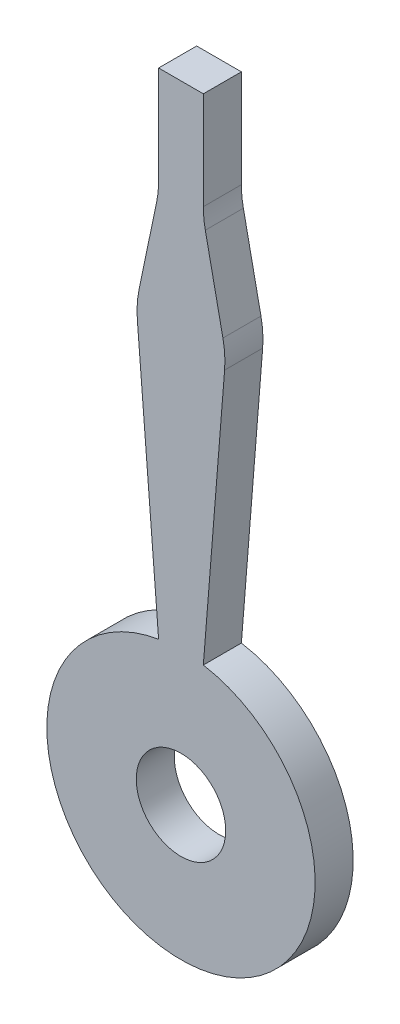
ISO-10303-21;
HEADER;
FILE_DESCRIPTION(('STEP AP214'),'2;1');
FILE_NAME('part.step','',(''),(''),'','','');
FILE_SCHEMA(('AUTOMOTIVE_DESIGN { 1 0 10303 214 1 1 1 1 }'));
ENDSEC;
DATA;
#1=APPLICATION_CONTEXT('core data for automotive mechanical design processes');
#2=APPLICATION_PROTOCOL_DEFINITION('international standard','automotive_design',2000,#1);
#3=PRODUCT_CONTEXT('',#1,'mechanical');
#4=PRODUCT('Part','Part','',(#3));
#5=PRODUCT_RELATED_PRODUCT_CATEGORY('part','',(#4));
#6=PRODUCT_DEFINITION_FORMATION('','',#4);
#7=PRODUCT_DEFINITION_CONTEXT('part definition',#1,'design');
#8=PRODUCT_DEFINITION('design','',#6,#7);
#9=PRODUCT_DEFINITION_SHAPE('','',#8);
#10=(LENGTH_UNIT() NAMED_UNIT(*) SI_UNIT(.MILLI.,.METRE.));
#11=(NAMED_UNIT(*) PLANE_ANGLE_UNIT() SI_UNIT($,.RADIAN.));
#12=(NAMED_UNIT(*) SI_UNIT($,.STERADIAN.) SOLID_ANGLE_UNIT());
#13=UNCERTAINTY_MEASURE_WITH_UNIT(LENGTH_MEASURE(1.E-05),#10,'distance_accuracy_value','');
#14=(GEOMETRIC_REPRESENTATION_CONTEXT(3) GLOBAL_UNCERTAINTY_ASSIGNED_CONTEXT((#13)) GLOBAL_UNIT_ASSIGNED_CONTEXT((#10,
#11,#12)) REPRESENTATION_CONTEXT('',''));
#15=CARTESIAN_POINT('',(0.,0.,0.));
#16=DIRECTION('',(0.,0.,1.));
#17=DIRECTION('',(1.,0.,0.));
#18=AXIS2_PLACEMENT_3D('',#15,#16,#17);
#19=CARTESIAN_POINT('',(0.,65.9,4.));
#20=DIRECTION('',(0.,1.,0.));
#21=DIRECTION('',(0.,0.,1.));
#22=AXIS2_PLACEMENT_3D('',#19,#20,#21);
#23=PLANE('',#22);
#24=DIRECTION('',(1.,0.,0.));
#25=VECTOR('',#24,1.);
#26=CARTESIAN_POINT('',(0.,65.9,0.));
#27=LINE('',#26,#25);
#28=CARTESIAN_POINT('',(-2.35,65.9,0.));
#29=VERTEX_POINT('',#28);
#30=CARTESIAN_POINT('',(2.35,65.9,0.));
#31=VERTEX_POINT('',#30);
#32=EDGE_CURVE('E155',#29,#31,#27,.T.);
#33=ORIENTED_EDGE('',*,*,#32,.F.);
#34=DIRECTION('',(0.,0.,-1.));
#35=VECTOR('',#34,1.);
#36=CARTESIAN_POINT('',(-2.35,65.9,4.));
#37=LINE('',#36,#35);
#38=CARTESIAN_POINT('',(-2.35,65.9,4.));
#39=VERTEX_POINT('',#38);
#40=EDGE_CURVE('E11',#39,#29,#37,.T.);
#41=ORIENTED_EDGE('',*,*,#40,.F.);
#42=DIRECTION('',(1.,0.,0.));
#43=VECTOR('',#42,1.);
#44=CARTESIAN_POINT('',(0.,65.9,4.));
#45=LINE('',#44,#43);
#46=CARTESIAN_POINT('',(2.35,65.9,4.));
#47=VERTEX_POINT('',#46);
#48=EDGE_CURVE('E189',#39,#47,#45,.T.);
#49=ORIENTED_EDGE('',*,*,#48,.T.);
#50=DIRECTION('',(0.,0.,-1.));
#51=VECTOR('',#50,1.);
#52=CARTESIAN_POINT('',(2.35,65.9,4.));
#53=LINE('',#52,#51);
#54=EDGE_CURVE('E51',#47,#31,#53,.T.);
#55=ORIENTED_EDGE('',*,*,#54,.T.);
#56=EDGE_LOOP('',(#33,#41,#49,#55));
#57=FACE_BOUND('',#56,.T.);
#58=ADVANCED_FACE('F35',(#57),#23,.T.);
#59=CARTESIAN_POINT('',(-2.3500000000005,0.,4.));
#60=DIRECTION('',(-1.,0.,0.));
#61=DIRECTION('',(0.,-1.,0.));
#62=AXIS2_PLACEMENT_3D('',#59,#60,#61);
#63=PLANE('',#62);
#64=DIRECTION('',(0.,1.,0.));
#65=VECTOR('',#64,1.);
#66=CARTESIAN_POINT('',(-2.3500000000005,0.,0.));
#67=LINE('',#66,#65);
#68=CARTESIAN_POINT('',(-2.35000000000008,55.6253357668643,0.));
#69=VERTEX_POINT('',#68);
#70=EDGE_CURVE('E157',#69,#29,#67,.T.);
#71=ORIENTED_EDGE('',*,*,#70,.F.);
#72=DIRECTION('',(0.,0.,-1.));
#73=VECTOR('',#72,1.);
#74=CARTESIAN_POINT('',(-2.35000000000008,55.6253357668643,4.));
#75=LINE('',#74,#73);
#76=CARTESIAN_POINT('',(-2.35000000000008,55.6253357668643,4.));
#77=VERTEX_POINT('',#76);
#78=EDGE_CURVE('E43',#77,#69,#75,.T.);
#79=ORIENTED_EDGE('',*,*,#78,.F.);
#80=DIRECTION('',(0.,1.,0.));
#81=VECTOR('',#80,1.);
#82=CARTESIAN_POINT('',(-2.3500000000005,0.,4.));
#83=LINE('',#82,#81);
#84=EDGE_CURVE('E221',#77,#39,#83,.T.);
#85=ORIENTED_EDGE('',*,*,#84,.T.);
#86=ORIENTED_EDGE('',*,*,#40,.T.);
#87=EDGE_LOOP('',(#71,#79,#85,#86));
#88=FACE_BOUND('',#87,.T.);
#89=ADVANCED_FACE('F220',(#88),#63,.T.);
#90=CARTESIAN_POINT('',(-12.35,55.6253357668643,4.));
#91=DIRECTION('',(0.,0.,-1.));
#92=DIRECTION('',(-1.,0.,0.));
#93=AXIS2_PLACEMENT_3D('',#90,#91,#92);
#94=CYLINDRICAL_SURFACE('',#93,9.99999999999992);
#95=CARTESIAN_POINT('',(-12.35,55.6253357668643,0.));
#96=DIRECTION('',(0.,0.,1.));
#97=DIRECTION('',(1.,0.,0.));
#98=AXIS2_PLACEMENT_3D('',#95,#96,#97);
#99=CIRCLE('',#98,9.99999999999992);
#100=CARTESIAN_POINT('',(-2.55936084221021,53.5898051525154,0.));
#101=VERTEX_POINT('',#100);
#102=EDGE_CURVE('E160',#69,#101,#99,.F.);
#103=ORIENTED_EDGE('',*,*,#102,.T.);
#104=DIRECTION('',(0.,0.,-1.));
#105=VECTOR('',#104,1.);
#106=CARTESIAN_POINT('',(-2.55936084221021,53.5898051525154,4.));
#107=LINE('',#106,#105);
#108=CARTESIAN_POINT('',(-2.55936084221021,53.5898051525154,4.));
#109=VERTEX_POINT('',#108);
#110=EDGE_CURVE('E204',#109,#101,#107,.T.);
#111=ORIENTED_EDGE('',*,*,#110,.F.);
#112=CARTESIAN_POINT('',(-12.35,55.6253357668643,4.));
#113=DIRECTION('',(0.,0.,1.));
#114=DIRECTION('',(1.,0.,0.));
#115=AXIS2_PLACEMENT_3D('',#112,#113,#114);
#116=CIRCLE('',#115,9.99999999999992);
#117=EDGE_CURVE('E210',#77,#109,#116,.F.);
#118=ORIENTED_EDGE('',*,*,#117,.F.);
#119=ORIENTED_EDGE('',*,*,#78,.T.);
#120=EDGE_LOOP('',(#103,#111,#118,#119));
#121=FACE_BOUND('',#120,.T.);
#122=ADVANCED_FACE('F208',(#121),#94,.F.);
#123=CARTESIAN_POINT('',(-13.1333070424788,2.73049063720624,4.));
#124=DIRECTION('',(-0.979063915778987,0.203553061434893,0.));
#125=DIRECTION('',(-0.203553061434893,-0.979063915778987,0.));
#126=AXIS2_PLACEMENT_3D('',#123,#124,#125);
#127=PLANE('',#126);
#128=DIRECTION('',(0.203553061434893,0.979063915778987,0.));
#129=VECTOR('',#128,1.);
#130=CARTESIAN_POINT('',(-13.1333070424788,2.73049063720624,0.));
#131=LINE('',#130,#129);
#132=CARTESIAN_POINT('',(-4.40819343713173,44.6971593370033,0.));
#133=VERTEX_POINT('',#132);
#134=EDGE_CURVE('E163',#133,#101,#131,.T.);
#135=ORIENTED_EDGE('',*,*,#134,.F.);
#136=DIRECTION('',(0.,0.,-1.));
#137=VECTOR('',#136,1.);
#138=CARTESIAN_POINT('',(-4.40819343713173,44.6971593370033,4.));
#139=LINE('',#138,#137);
#140=CARTESIAN_POINT('',(-4.40819343713173,44.6971593370033,4.));
#141=VERTEX_POINT('',#140);
#142=EDGE_CURVE('E202',#141,#133,#139,.T.);
#143=ORIENTED_EDGE('',*,*,#142,.F.);
#144=DIRECTION('',(0.203553061434893,0.979063915778987,0.));
#145=VECTOR('',#144,1.);
#146=CARTESIAN_POINT('',(-13.1333070424788,2.73049063720624,4.));
#147=LINE('',#146,#145);
#148=EDGE_CURVE('E390',#141,#109,#147,.T.);
#149=ORIENTED_EDGE('',*,*,#148,.T.);
#150=ORIENTED_EDGE('',*,*,#110,.T.);
#151=EDGE_LOOP('',(#135,#143,#149,#150));
#152=FACE_BOUND('',#151,.T.);
#153=ADVANCED_FACE('F240',(#152),#127,.T.);
#154=CARTESIAN_POINT('',(5.38244572065814,42.6616287226543,4.));
#155=DIRECTION('',(0.,0.,-1.));
#156=DIRECTION('',(-1.,0.,0.));
#157=AXIS2_PLACEMENT_3D('',#154,#155,#156);
#158=CYLINDRICAL_SURFACE('',#157,10.);
#159=CARTESIAN_POINT('',(5.38244572065814,42.6616287226543,0.));
#160=DIRECTION('',(0.,0.,1.));
#161=DIRECTION('',(1.,0.,0.));
#162=AXIS2_PLACEMENT_3D('',#159,#160,#161);
#163=CIRCLE('',#162,10.);
#164=CARTESIAN_POINT('',(-4.58574117645546,41.8646030115178,0.));
#165=VERTEX_POINT('',#164);
#166=EDGE_CURVE('E166',#133,#165,#163,.T.);
#167=ORIENTED_EDGE('',*,*,#166,.T.);
#168=DIRECTION('',(0.,0.,-1.));
#169=VECTOR('',#168,1.);
#170=CARTESIAN_POINT('',(-4.58574117645546,41.8646030115178,4.));
#171=LINE('',#170,#169);
#172=CARTESIAN_POINT('',(-4.58574117645546,41.8646030115178,4.));
#173=VERTEX_POINT('',#172);
#174=EDGE_CURVE('E200',#173,#165,#171,.T.);
#175=ORIENTED_EDGE('',*,*,#174,.F.);
#176=CARTESIAN_POINT('',(5.38244572065814,42.6616287226543,4.));
#177=DIRECTION('',(0.,0.,1.));
#178=DIRECTION('',(1.,0.,0.));
#179=AXIS2_PLACEMENT_3D('',#176,#177,#178);
#180=CIRCLE('',#179,10.);
#181=EDGE_CURVE('E391',#141,#173,#180,.T.);
#182=ORIENTED_EDGE('',*,*,#181,.F.);
#183=ORIENTED_EDGE('',*,*,#142,.T.);
#184=EDGE_LOOP('',(#167,#175,#182,#183));
#185=FACE_BOUND('',#184,.T.);
#186=ADVANCED_FACE('F245',(#185),#158,.T.);
#187=CARTESIAN_POINT('',(-1.230508888213,-0.0983877240475712,4.));
#188=DIRECTION('',(-0.99681868971136,-0.0797025711136562,0.));
#189=DIRECTION('',(0.0797025711136562,-0.99681868971136,0.));
#190=AXIS2_PLACEMENT_3D('',#187,#188,#189);
#191=PLANE('',#190);
#192=DIRECTION('',(-0.0797025711136562,0.99681868971136,0.));
#193=VECTOR('',#192,1.);
#194=CARTESIAN_POINT('',(-1.230508888213,-0.0983877240475712,0.));
#195=LINE('',#194,#193);
#196=CARTESIAN_POINT('',(-2.35,13.9027874902841,0.));
#197=VERTEX_POINT('',#196);
#198=EDGE_CURVE('E169',#197,#165,#195,.T.);
#199=ORIENTED_EDGE('',*,*,#198,.F.);
#200=DIRECTION('',(0.,0.,-1.));
#201=VECTOR('',#200,1.);
#202=CARTESIAN_POINT('',(-2.35,13.9027874902841,4.));
#203=LINE('',#202,#201);
#204=CARTESIAN_POINT('',(-2.35,13.9027874902841,4.));
#205=VERTEX_POINT('',#204);
#206=EDGE_CURVE('E198',#205,#197,#203,.T.);
#207=ORIENTED_EDGE('',*,*,#206,.F.);
#208=DIRECTION('',(-0.0797025711136562,0.99681868971136,0.));
#209=VECTOR('',#208,1.);
#210=CARTESIAN_POINT('',(-1.230508888213,-0.0983877240475712,4.));
#211=LINE('',#210,#209);
#212=EDGE_CURVE('E385',#205,#173,#211,.T.);
#213=ORIENTED_EDGE('',*,*,#212,.T.);
#214=ORIENTED_EDGE('',*,*,#174,.T.);
#215=EDGE_LOOP('',(#199,#207,#213,#214));
#216=FACE_BOUND('',#215,.T.);
#217=ADVANCED_FACE('F249',(#216),#191,.T.);
#218=CARTESIAN_POINT('',(0.,0.,4.));
#219=DIRECTION('',(0.,0.,-1.));
#220=DIRECTION('',(-1.,0.,0.));
#221=AXIS2_PLACEMENT_3D('',#218,#219,#220);
#222=CYLINDRICAL_SURFACE('',#221,14.1);
#223=CARTESIAN_POINT('',(0.,0.,0.));
#224=DIRECTION('',(0.,0.,1.));
#225=DIRECTION('',(1.,0.,0.));
#226=AXIS2_PLACEMENT_3D('',#223,#224,#225);
#227=CIRCLE('',#226,14.1);
#228=CARTESIAN_POINT('',(2.35,13.9027874902841,0.));
#229=VERTEX_POINT('',#228);
#230=EDGE_CURVE('E172',#197,#229,#227,.T.);
#231=ORIENTED_EDGE('',*,*,#230,.T.);
#232=DIRECTION('',(0.,0.,-1.));
#233=VECTOR('',#232,1.);
#234=CARTESIAN_POINT('',(2.35,13.9027874902841,4.));
#235=LINE('',#234,#233);
#236=CARTESIAN_POINT('',(2.35,13.9027874902841,4.));
#237=VERTEX_POINT('',#236);
#238=EDGE_CURVE('E195',#237,#229,#235,.T.);
#239=ORIENTED_EDGE('',*,*,#238,.F.);
#240=CARTESIAN_POINT('',(0.,0.,4.));
#241=DIRECTION('',(0.,0.,1.));
#242=DIRECTION('',(1.,0.,0.));
#243=AXIS2_PLACEMENT_3D('',#240,#241,#242);
#244=CIRCLE('',#243,14.1);
#245=EDGE_CURVE('E382',#205,#237,#244,.T.);
#246=ORIENTED_EDGE('',*,*,#245,.F.);
#247=ORIENTED_EDGE('',*,*,#206,.T.);
#248=EDGE_LOOP('',(#231,#239,#246,#247));
#249=FACE_BOUND('',#248,.T.);
#250=ADVANCED_FACE('F253',(#249),#222,.T.);
#251=CARTESIAN_POINT('',(1.230508888213,-0.0983877240475711,4.));
#252=DIRECTION('',(-0.99681868971136,0.0797025711136564,0.));
#253=DIRECTION('',(-0.0797025711136564,-0.99681868971136,0.));
#254=AXIS2_PLACEMENT_3D('',#251,#252,#253);
#255=PLANE('',#254);
#256=DIRECTION('',(0.0797025711136564,0.99681868971136,0.));
#257=VECTOR('',#256,1.);
#258=CARTESIAN_POINT('',(1.230508888213,-0.0983877240475711,0.));
#259=LINE('',#258,#257);
#260=CARTESIAN_POINT('',(4.58574117645545,41.8646030115177,0.));
#261=VERTEX_POINT('',#260);
#262=EDGE_CURVE('E174',#229,#261,#259,.T.);
#263=ORIENTED_EDGE('',*,*,#262,.T.);
#264=DIRECTION('',(0.,0.,-1.));
#265=VECTOR('',#264,1.);
#266=CARTESIAN_POINT('',(4.58574117645545,41.8646030115177,4.));
#267=LINE('',#266,#265);
#268=CARTESIAN_POINT('',(4.58574117645545,41.8646030115177,4.));
#269=VERTEX_POINT('',#268);
#270=EDGE_CURVE('E193',#269,#261,#267,.T.);
#271=ORIENTED_EDGE('',*,*,#270,.F.);
#272=DIRECTION('',(0.0797025711136564,0.99681868971136,0.));
#273=VECTOR('',#272,1.);
#274=CARTESIAN_POINT('',(1.230508888213,-0.0983877240475711,4.));
#275=LINE('',#274,#273);
#276=EDGE_CURVE('E380',#237,#269,#275,.T.);
#277=ORIENTED_EDGE('',*,*,#276,.F.);
#278=ORIENTED_EDGE('',*,*,#238,.T.);
#279=EDGE_LOOP('',(#263,#271,#277,#278));
#280=FACE_BOUND('',#279,.T.);
#281=ADVANCED_FACE('F257',(#280),#255,.F.);
#282=CARTESIAN_POINT('',(-5.38244572065814,42.6616287226543,4.));
#283=DIRECTION('',(0.,0.,-1.));
#284=DIRECTION('',(-1.,0.,0.));
#285=AXIS2_PLACEMENT_3D('',#282,#283,#284);
#286=CYLINDRICAL_SURFACE('',#285,9.99999999999999);
#287=CARTESIAN_POINT('',(-5.38244572065814,42.6616287226543,0.));
#288=DIRECTION('',(0.,0.,1.));
#289=DIRECTION('',(1.,0.,0.));
#290=AXIS2_PLACEMENT_3D('',#287,#288,#289);
#291=CIRCLE('',#290,9.99999999999999);
#292=CARTESIAN_POINT('',(4.40819343713169,44.6971593370033,0.));
#293=VERTEX_POINT('',#292);
#294=EDGE_CURVE('E177',#293,#261,#291,.F.);
#295=ORIENTED_EDGE('',*,*,#294,.F.);
#296=DIRECTION('',(0.,0.,-1.));
#297=VECTOR('',#296,1.);
#298=CARTESIAN_POINT('',(4.40819343713169,44.6971593370033,4.));
#299=LINE('',#298,#297);
#300=CARTESIAN_POINT('',(4.40819343713169,44.6971593370033,4.));
#301=VERTEX_POINT('',#300);
#302=EDGE_CURVE('E134',#301,#293,#299,.T.);
#303=ORIENTED_EDGE('',*,*,#302,.F.);
#304=CARTESIAN_POINT('',(-5.38244572065814,42.6616287226543,4.));
#305=DIRECTION('',(0.,0.,1.));
#306=DIRECTION('',(1.,0.,0.));
#307=AXIS2_PLACEMENT_3D('',#304,#305,#306);
#308=CIRCLE('',#307,9.99999999999999);
#309=EDGE_CURVE('E144',#301,#269,#308,.F.);
#310=ORIENTED_EDGE('',*,*,#309,.T.);
#311=ORIENTED_EDGE('',*,*,#270,.T.);
#312=EDGE_LOOP('',(#295,#303,#310,#311));
#313=FACE_BOUND('',#312,.T.);
#314=ADVANCED_FACE('F261',(#313),#286,.T.);
#315=CARTESIAN_POINT('',(13.1333070424795,2.73049063720662,4.));
#316=DIRECTION('',(0.979063915778983,0.203553061434911,0.));
#317=DIRECTION('',(-0.203553061434911,0.979063915778983,0.));
#318=AXIS2_PLACEMENT_3D('',#315,#316,#317);
#319=PLANE('',#318);
#320=DIRECTION('',(0.203553061434911,-0.979063915778983,0.));
#321=VECTOR('',#320,1.);
#322=CARTESIAN_POINT('',(13.1333070424795,2.73049063720662,0.));
#323=LINE('',#322,#321);
#324=CARTESIAN_POINT('',(2.55936084221005,53.5898051525152,0.));
#325=VERTEX_POINT('',#324);
#326=EDGE_CURVE('E130',#325,#293,#323,.T.);
#327=ORIENTED_EDGE('',*,*,#326,.F.);
#328=DIRECTION('',(0.,0.,-1.));
#329=VECTOR('',#328,1.);
#330=CARTESIAN_POINT('',(2.55936084221005,53.5898051525152,4.));
#331=LINE('',#330,#329);
#332=CARTESIAN_POINT('',(2.55936084221005,53.5898051525152,4.));
#333=VERTEX_POINT('',#332);
#334=EDGE_CURVE('E125',#333,#325,#331,.T.);
#335=ORIENTED_EDGE('',*,*,#334,.F.);
#336=DIRECTION('',(0.203553061434911,-0.979063915778983,0.));
#337=VECTOR('',#336,1.);
#338=CARTESIAN_POINT('',(13.1333070424795,2.73049063720662,4.));
#339=LINE('',#338,#337);
#340=EDGE_CURVE('E128',#333,#301,#339,.T.);
#341=ORIENTED_EDGE('',*,*,#340,.T.);
#342=ORIENTED_EDGE('',*,*,#302,.T.);
#343=EDGE_LOOP('',(#327,#335,#341,#342));
#344=FACE_BOUND('',#343,.T.);
#345=ADVANCED_FACE('F127',(#344),#319,.T.);
#346=CARTESIAN_POINT('',(12.35,55.6253357668643,4.));
#347=DIRECTION('',(0.,0.,-1.));
#348=DIRECTION('',(-1.,0.,0.));
#349=AXIS2_PLACEMENT_3D('',#346,#347,#348);
#350=CYLINDRICAL_SURFACE('',#349,10.0000000000001);
#351=CARTESIAN_POINT('',(12.35,55.6253357668643,0.));
#352=DIRECTION('',(0.,0.,1.));
#353=DIRECTION('',(1.,0.,0.));
#354=AXIS2_PLACEMENT_3D('',#351,#352,#353);
#355=CIRCLE('',#354,10.0000000000001);
#356=CARTESIAN_POINT('',(2.34999999999988,55.6253357668643,0.));
#357=VERTEX_POINT('',#356);
#358=EDGE_CURVE('E181',#357,#325,#355,.T.);
#359=ORIENTED_EDGE('',*,*,#358,.F.);
#360=DIRECTION('',(0.,0.,-1.));
#361=VECTOR('',#360,1.);
#362=CARTESIAN_POINT('',(2.34999999999988,55.6253357668643,4.));
#363=LINE('',#362,#361);
#364=CARTESIAN_POINT('',(2.34999999999988,55.6253357668643,4.));
#365=VERTEX_POINT('',#364);
#366=EDGE_CURVE('E88',#365,#357,#363,.T.);
#367=ORIENTED_EDGE('',*,*,#366,.F.);
#368=CARTESIAN_POINT('',(12.35,55.6253357668643,4.));
#369=DIRECTION('',(0.,0.,1.));
#370=DIRECTION('',(1.,0.,0.));
#371=AXIS2_PLACEMENT_3D('',#368,#369,#370);
#372=CIRCLE('',#371,10.0000000000001);
#373=EDGE_CURVE('E142',#365,#333,#372,.T.);
#374=ORIENTED_EDGE('',*,*,#373,.T.);
#375=ORIENTED_EDGE('',*,*,#334,.T.);
#376=EDGE_LOOP('',(#359,#367,#374,#375));
#377=FACE_BOUND('',#376,.T.);
#378=ADVANCED_FACE('F146',(#377),#350,.F.);
#379=CARTESIAN_POINT('',(2.34999999999924,0.,4.));
#380=DIRECTION('',(1.,0.,0.));
#381=DIRECTION('',(0.,1.,0.));
#382=AXIS2_PLACEMENT_3D('',#379,#380,#381);
#383=PLANE('',#382);
#384=DIRECTION('',(0.,-1.,0.));
#385=VECTOR('',#384,1.);
#386=CARTESIAN_POINT('',(2.34999999999924,0.,0.));
#387=LINE('',#386,#385);
#388=EDGE_CURVE('E183',#31,#357,#387,.T.);
#389=ORIENTED_EDGE('',*,*,#388,.F.);
#390=ORIENTED_EDGE('',*,*,#54,.F.);
#391=DIRECTION('',(0.,-1.,0.));
#392=VECTOR('',#391,1.);
#393=CARTESIAN_POINT('',(2.34999999999924,0.,4.));
#394=LINE('',#393,#392);
#395=EDGE_CURVE('E147',#47,#365,#394,.T.);
#396=ORIENTED_EDGE('',*,*,#395,.T.);
#397=ORIENTED_EDGE('',*,*,#366,.T.);
#398=EDGE_LOOP('',(#389,#390,#396,#397));
#399=FACE_BOUND('',#398,.T.);
#400=ADVANCED_FACE('F222',(#399),#383,.T.);
#401=CARTESIAN_POINT('',(0.,0.,4.));
#402=DIRECTION('',(0.,0.,-1.));
#403=DIRECTION('',(-1.,0.,0.));
#404=AXIS2_PLACEMENT_3D('',#401,#402,#403);
#405=CYLINDRICAL_SURFACE('',#404,4.7);
#406=CARTESIAN_POINT('',(0.,0.,4.));
#407=DIRECTION('',(0.,0.,1.));
#408=DIRECTION('',(1.,0.,0.));
#409=AXIS2_PLACEMENT_3D('',#406,#407,#408);
#410=CIRCLE('',#409,4.7);
#411=CARTESIAN_POINT('',(4.7,0.,4.));
#412=VERTEX_POINT('',#411);
#413=EDGE_CURVE('E149',#412,#412,#410,.T.);
#414=ORIENTED_EDGE('',*,*,#413,.T.);
#415=EDGE_LOOP('',(#414));
#416=FACE_BOUND('',#415,.T.);
#417=CARTESIAN_POINT('',(0.,0.,0.));
#418=DIRECTION('',(0.,0.,1.));
#419=DIRECTION('',(1.,0.,0.));
#420=AXIS2_PLACEMENT_3D('',#417,#418,#419);
#421=CIRCLE('',#420,4.7);
#422=CARTESIAN_POINT('',(4.7,0.,0.));
#423=VERTEX_POINT('',#422);
#424=EDGE_CURVE('E186',#423,#423,#421,.T.);
#425=ORIENTED_EDGE('',*,*,#424,.F.);
#426=EDGE_LOOP('',(#425));
#427=FACE_BOUND('',#426,.T.);
#428=ADVANCED_FACE('F224',(#416,#427),#405,.F.);
#429=CARTESIAN_POINT('',(0.,0.,4.));
#430=DIRECTION('',(0.,0.,1.));
#431=DIRECTION('',(1.,0.,0.));
#432=AXIS2_PLACEMENT_3D('',#429,#430,#431);
#433=PLANE('',#432);
#434=ORIENTED_EDGE('',*,*,#48,.F.);
#435=ORIENTED_EDGE('',*,*,#84,.F.);
#436=ORIENTED_EDGE('',*,*,#117,.T.);
#437=ORIENTED_EDGE('',*,*,#148,.F.);
#438=ORIENTED_EDGE('',*,*,#181,.T.);
#439=ORIENTED_EDGE('',*,*,#212,.F.);
#440=ORIENTED_EDGE('',*,*,#245,.T.);
#441=ORIENTED_EDGE('',*,*,#276,.T.);
#442=ORIENTED_EDGE('',*,*,#309,.F.);
#443=ORIENTED_EDGE('',*,*,#340,.F.);
#444=ORIENTED_EDGE('',*,*,#373,.F.);
#445=ORIENTED_EDGE('',*,*,#395,.F.);
#446=EDGE_LOOP('',(#434,#435,#436,#437,#438,#439,#440,#441,#442,#443,#444,#445));
#447=FACE_BOUND('',#446,.T.);
#448=ORIENTED_EDGE('',*,*,#413,.F.);
#449=EDGE_LOOP('',(#448));
#450=FACE_BOUND('',#449,.T.);
#451=ADVANCED_FACE('F139',(#447,#450),#433,.T.);
#452=CARTESIAN_POINT('',(0.,0.,0.));
#453=DIRECTION('',(0.,0.,1.));
#454=DIRECTION('',(1.,0.,0.));
#455=AXIS2_PLACEMENT_3D('',#452,#453,#454);
#456=PLANE('',#455);
#457=ORIENTED_EDGE('',*,*,#32,.T.);
#458=ORIENTED_EDGE('',*,*,#388,.T.);
#459=ORIENTED_EDGE('',*,*,#358,.T.);
#460=ORIENTED_EDGE('',*,*,#326,.T.);
#461=ORIENTED_EDGE('',*,*,#294,.T.);
#462=ORIENTED_EDGE('',*,*,#262,.F.);
#463=ORIENTED_EDGE('',*,*,#230,.F.);
#464=ORIENTED_EDGE('',*,*,#198,.T.);
#465=ORIENTED_EDGE('',*,*,#166,.F.);
#466=ORIENTED_EDGE('',*,*,#134,.T.);
#467=ORIENTED_EDGE('',*,*,#102,.F.);
#468=ORIENTED_EDGE('',*,*,#70,.T.);
#469=EDGE_LOOP('',(#457,#458,#459,#460,#461,#462,#463,#464,#465,#466,#467,#468));
#470=FACE_BOUND('',#469,.T.);
#471=ORIENTED_EDGE('',*,*,#424,.T.);
#472=EDGE_LOOP('',(#471));
#473=FACE_BOUND('',#472,.T.);
#474=ADVANCED_FACE('F216',(#470,#473),#456,.F.);
#475=CLOSED_SHELL('',(#58,#89,#122,#153,#186,#217,#250,#281,#314,#345,#378,#400,#428,#451,#474));
#476=MANIFOLD_SOLID_BREP('B2',#475);
#477=ADVANCED_BREP_SHAPE_REPRESENTATION('',(#18,#476),#14);
#478=SHAPE_DEFINITION_REPRESENTATION(#9,#477);
ENDSEC;
END-ISO-10303-21;
